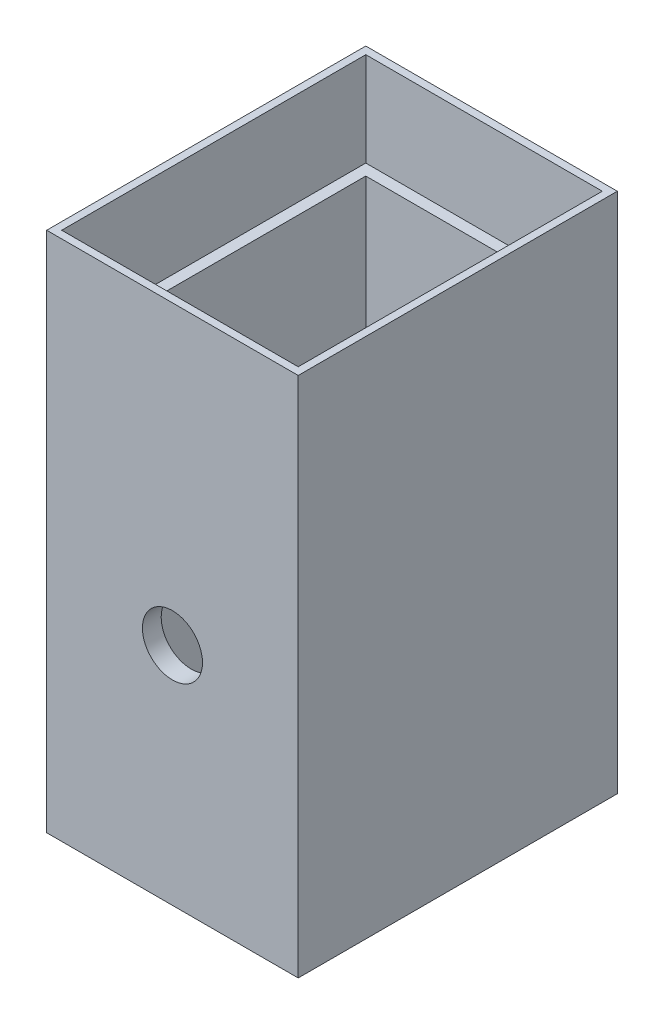
ISO-10303-21;
HEADER;
FILE_DESCRIPTION(('STEP AP214'),'2;1');
FILE_NAME('part.step','',(''),(''),'','','');
FILE_SCHEMA(('AUTOMOTIVE_DESIGN { 1 0 10303 214 1 1 1 1 }'));
ENDSEC;
DATA;
#1=APPLICATION_CONTEXT('core data for automotive mechanical design processes');
#2=APPLICATION_PROTOCOL_DEFINITION('international standard','automotive_design',2000,#1);
#3=PRODUCT_CONTEXT('',#1,'mechanical');
#4=PRODUCT('Part','Part','',(#3));
#5=PRODUCT_RELATED_PRODUCT_CATEGORY('part','',(#4));
#6=PRODUCT_DEFINITION_FORMATION('','',#4);
#7=PRODUCT_DEFINITION_CONTEXT('part definition',#1,'design');
#8=PRODUCT_DEFINITION('design','',#6,#7);
#9=PRODUCT_DEFINITION_SHAPE('','',#8);
#10=(LENGTH_UNIT() NAMED_UNIT(*) SI_UNIT(.MILLI.,.METRE.));
#11=(NAMED_UNIT(*) PLANE_ANGLE_UNIT() SI_UNIT($,.RADIAN.));
#12=(NAMED_UNIT(*) SI_UNIT($,.STERADIAN.) SOLID_ANGLE_UNIT());
#13=UNCERTAINTY_MEASURE_WITH_UNIT(LENGTH_MEASURE(1.E-05),#10,'distance_accuracy_value','');
#14=(GEOMETRIC_REPRESENTATION_CONTEXT(3) GLOBAL_UNCERTAINTY_ASSIGNED_CONTEXT((#13)) GLOBAL_UNIT_ASSIGNED_CONTEXT((#10,
#11,#12)) REPRESENTATION_CONTEXT('',''));
#15=CARTESIAN_POINT('',(0.,0.,0.));
#16=DIRECTION('',(0.,0.,1.));
#17=DIRECTION('',(1.,0.,0.));
#18=AXIS2_PLACEMENT_3D('',#15,#16,#17);
#19=CARTESIAN_POINT('',(0.,114.,0.));
#20=DIRECTION('',(0.,1.,0.));
#21=DIRECTION('',(0.,0.,1.));
#22=AXIS2_PLACEMENT_3D('',#19,#20,#21);
#23=PLANE('',#22);
#24=DIRECTION('',(0.,0.,-1.));
#25=VECTOR('',#24,1.);
#26=CARTESIAN_POINT('',(31.5,114.,40.5));
#27=LINE('',#26,#25);
#28=CARTESIAN_POINT('',(31.5,114.,40.5));
#29=VERTEX_POINT('',#28);
#30=CARTESIAN_POINT('',(31.5,114.,-40.5));
#31=VERTEX_POINT('',#30);
#32=EDGE_CURVE('E189',#29,#31,#27,.T.);
#33=ORIENTED_EDGE('',*,*,#32,.T.);
#34=DIRECTION('',(-1.,0.,0.));
#35=VECTOR('',#34,1.);
#36=CARTESIAN_POINT('',(31.5,114.,-40.5));
#37=LINE('',#36,#35);
#38=CARTESIAN_POINT('',(-31.5,114.,-40.5));
#39=VERTEX_POINT('',#38);
#40=EDGE_CURVE('E202',#31,#39,#37,.T.);
#41=ORIENTED_EDGE('',*,*,#40,.T.);
#42=DIRECTION('',(0.,0.,1.));
#43=VECTOR('',#42,1.);
#44=CARTESIAN_POINT('',(-31.5,114.,40.5));
#45=LINE('',#44,#43);
#46=CARTESIAN_POINT('',(-31.5,114.,40.5));
#47=VERTEX_POINT('',#46);
#48=EDGE_CURVE('E204',#39,#47,#45,.T.);
#49=ORIENTED_EDGE('',*,*,#48,.T.);
#50=DIRECTION('',(1.,0.,0.));
#51=VECTOR('',#50,1.);
#52=CARTESIAN_POINT('',(31.5,114.,40.5));
#53=LINE('',#52,#51);
#54=EDGE_CURVE('E193',#47,#29,#53,.T.);
#55=ORIENTED_EDGE('',*,*,#54,.T.);
#56=EDGE_LOOP('',(#33,#41,#49,#55));
#57=FACE_BOUND('',#56,.T.);
#58=DIRECTION('',(-1.,0.,0.));
#59=VECTOR('',#58,1.);
#60=CARTESIAN_POINT('',(-28.5,114.,-37.5));
#61=LINE('',#60,#59);
#62=CARTESIAN_POINT('',(28.5,114.,-37.5));
#63=VERTEX_POINT('',#62);
#64=CARTESIAN_POINT('',(-28.5,114.,-37.5));
#65=VERTEX_POINT('',#64);
#66=EDGE_CURVE('E232',#63,#65,#61,.T.);
#67=ORIENTED_EDGE('',*,*,#66,.F.);
#68=DIRECTION('',(0.,0.,-1.));
#69=VECTOR('',#68,1.);
#70=CARTESIAN_POINT('',(28.5,114.,-37.5));
#71=LINE('',#70,#69);
#72=CARTESIAN_POINT('',(28.5,114.,37.5));
#73=VERTEX_POINT('',#72);
#74=EDGE_CURVE('E230',#73,#63,#71,.T.);
#75=ORIENTED_EDGE('',*,*,#74,.F.);
#76=DIRECTION('',(1.,0.,0.));
#77=VECTOR('',#76,1.);
#78=CARTESIAN_POINT('',(-28.5,114.,37.5));
#79=LINE('',#78,#77);
#80=CARTESIAN_POINT('',(-28.5,114.,37.5));
#81=VERTEX_POINT('',#80);
#82=EDGE_CURVE('E237',#81,#73,#79,.T.);
#83=ORIENTED_EDGE('',*,*,#82,.F.);
#84=DIRECTION('',(0.,0.,1.));
#85=VECTOR('',#84,1.);
#86=CARTESIAN_POINT('',(-28.5,114.,-37.5));
#87=LINE('',#86,#85);
#88=EDGE_CURVE('E234',#65,#81,#87,.T.);
#89=ORIENTED_EDGE('',*,*,#88,.F.);
#90=EDGE_LOOP('',(#67,#75,#83,#89));
#91=FACE_BOUND('',#90,.T.);
#92=ADVANCED_FACE('F37',(#57,#91),#23,.T.);
#93=CARTESIAN_POINT('',(28.5,114.,-37.5));
#94=DIRECTION('',(-1.,0.,0.));
#95=DIRECTION('',(0.,0.,1.));
#96=AXIS2_PLACEMENT_3D('',#93,#94,#95);
#97=PLANE('',#96);
#98=DIRECTION('',(0.,-1.,0.));
#99=VECTOR('',#98,1.);
#100=CARTESIAN_POINT('',(28.5,114.,-37.5));
#101=LINE('',#100,#99);
#102=CARTESIAN_POINT('',(28.5,4.,-37.5));
#103=VERTEX_POINT('',#102);
#104=EDGE_CURVE('E248',#63,#103,#101,.T.);
#105=ORIENTED_EDGE('',*,*,#104,.T.);
#106=DIRECTION('',(0.,0.,1.));
#107=VECTOR('',#106,1.);
#108=CARTESIAN_POINT('',(28.5,4.,0.));
#109=LINE('',#108,#107);
#110=CARTESIAN_POINT('',(28.5,4.,37.5));
#111=VERTEX_POINT('',#110);
#112=EDGE_CURVE('E260',#103,#111,#109,.T.);
#113=ORIENTED_EDGE('',*,*,#112,.T.);
#114=DIRECTION('',(0.,-1.,0.));
#115=VECTOR('',#114,1.);
#116=CARTESIAN_POINT('',(28.5,114.,37.5));
#117=LINE('',#116,#115);
#118=EDGE_CURVE('E239',#73,#111,#117,.T.);
#119=ORIENTED_EDGE('',*,*,#118,.F.);
#120=ORIENTED_EDGE('',*,*,#74,.T.);
#121=EDGE_LOOP('',(#105,#113,#119,#120));
#122=FACE_BOUND('',#121,.T.);
#123=ADVANCED_FACE('F306',(#122),#97,.T.);
#124=CARTESIAN_POINT('',(-28.5,114.,-37.5));
#125=DIRECTION('',(0.,0.,1.));
#126=DIRECTION('',(1.,0.,0.));
#127=AXIS2_PLACEMENT_3D('',#124,#125,#126);
#128=PLANE('',#127);
#129=DIRECTION('',(0.,-1.,0.));
#130=VECTOR('',#129,1.);
#131=CARTESIAN_POINT('',(-23.5,114.,-37.5));
#132=LINE('',#131,#130);
#133=CARTESIAN_POINT('',(-23.5,22.,-37.5));
#134=VERTEX_POINT('',#133);
#135=CARTESIAN_POINT('',(-23.5,7.,-37.5));
#136=VERTEX_POINT('',#135);
#137=EDGE_CURVE('E181',#134,#136,#132,.T.);
#138=ORIENTED_EDGE('',*,*,#137,.F.);
#139=DIRECTION('',(-1.,0.,0.));
#140=VECTOR('',#139,1.);
#141=CARTESIAN_POINT('',(-28.5,22.,-37.5));
#142=LINE('',#141,#140);
#143=CARTESIAN_POINT('',(-13.5,22.,-37.5));
#144=VERTEX_POINT('',#143);
#145=EDGE_CURVE('E174',#144,#134,#142,.T.);
#146=ORIENTED_EDGE('',*,*,#145,.F.);
#147=DIRECTION('',(0.,1.,0.));
#148=VECTOR('',#147,1.);
#149=CARTESIAN_POINT('',(-13.5,114.,-37.5));
#150=LINE('',#149,#148);
#151=CARTESIAN_POINT('',(-13.5,7.,-37.5));
#152=VERTEX_POINT('',#151);
#153=EDGE_CURVE('E155',#152,#144,#150,.T.);
#154=ORIENTED_EDGE('',*,*,#153,.F.);
#155=DIRECTION('',(1.,0.,0.));
#156=VECTOR('',#155,1.);
#157=CARTESIAN_POINT('',(-28.5,7.00000000000001,-37.5));
#158=LINE('',#157,#156);
#159=EDGE_CURVE('E179',#136,#152,#158,.T.);
#160=ORIENTED_EDGE('',*,*,#159,.F.);
#161=EDGE_LOOP('',(#138,#146,#154,#160));
#162=FACE_BOUND('',#161,.T.);
#163=DIRECTION('',(0.,-1.,0.));
#164=VECTOR('',#163,1.);
#165=CARTESIAN_POINT('',(-28.5,114.,-37.5));
#166=LINE('',#165,#164);
#167=CARTESIAN_POINT('',(-28.5,4.,-37.5));
#168=VERTEX_POINT('',#167);
#169=EDGE_CURVE('E245',#65,#168,#166,.T.);
#170=ORIENTED_EDGE('',*,*,#169,.T.);
#171=DIRECTION('',(1.,0.,0.));
#172=VECTOR('',#171,1.);
#173=CARTESIAN_POINT('',(0.,4.,-37.5));
#174=LINE('',#173,#172);
#175=EDGE_CURVE('E257',#168,#103,#174,.T.);
#176=ORIENTED_EDGE('',*,*,#175,.T.);
#177=ORIENTED_EDGE('',*,*,#104,.F.);
#178=ORIENTED_EDGE('',*,*,#66,.T.);
#179=EDGE_LOOP('',(#170,#176,#177,#178));
#180=FACE_BOUND('',#179,.T.);
#181=ADVANCED_FACE('F312',(#162,#180),#128,.T.);
#182=CARTESIAN_POINT('',(-28.5,114.,-37.5));
#183=DIRECTION('',(1.,0.,0.));
#184=DIRECTION('',(0.,0.,-1.));
#185=AXIS2_PLACEMENT_3D('',#182,#183,#184);
#186=PLANE('',#185);
#187=DIRECTION('',(0.,-1.,0.));
#188=VECTOR('',#187,1.);
#189=CARTESIAN_POINT('',(-28.5,114.,37.5));
#190=LINE('',#189,#188);
#191=CARTESIAN_POINT('',(-28.5,4.00000000000003,37.5));
#192=VERTEX_POINT('',#191);
#193=EDGE_CURVE('E242',#81,#192,#190,.T.);
#194=ORIENTED_EDGE('',*,*,#193,.T.);
#195=DIRECTION('',(0.,0.,-1.));
#196=VECTOR('',#195,1.);
#197=CARTESIAN_POINT('',(-28.5,4.,0.));
#198=LINE('',#197,#196);
#199=EDGE_CURVE('E254',#192,#168,#198,.T.);
#200=ORIENTED_EDGE('',*,*,#199,.T.);
#201=ORIENTED_EDGE('',*,*,#169,.F.);
#202=ORIENTED_EDGE('',*,*,#88,.T.);
#203=EDGE_LOOP('',(#194,#200,#201,#202));
#204=FACE_BOUND('',#203,.T.);
#205=ADVANCED_FACE('F360',(#204),#186,.T.);
#206=CARTESIAN_POINT('',(-28.5,114.,37.5));
#207=DIRECTION('',(0.,0.,-1.));
#208=DIRECTION('',(-1.,0.,0.));
#209=AXIS2_PLACEMENT_3D('',#206,#207,#208);
#210=PLANE('',#209);
#211=CARTESIAN_POINT('',(0.,60.,37.5));
#212=DIRECTION('',(0.,0.,-1.));
#213=DIRECTION('',(-1.,0.,0.));
#214=AXIS2_PLACEMENT_3D('',#211,#212,#213);
#215=CIRCLE('',#214,8.);
#216=CARTESIAN_POINT('',(-8.,60.,37.5));
#217=VERTEX_POINT('',#216);
#218=EDGE_CURVE('E186',#217,#217,#215,.T.);
#219=ORIENTED_EDGE('',*,*,#218,.F.);
#220=EDGE_LOOP('',(#219));
#221=FACE_BOUND('',#220,.T.);
#222=ORIENTED_EDGE('',*,*,#118,.T.);
#223=DIRECTION('',(-1.,0.,0.));
#224=VECTOR('',#223,1.);
#225=CARTESIAN_POINT('',(0.,4.,37.5));
#226=LINE('',#225,#224);
#227=EDGE_CURVE('E251',#111,#192,#226,.T.);
#228=ORIENTED_EDGE('',*,*,#227,.T.);
#229=ORIENTED_EDGE('',*,*,#193,.F.);
#230=ORIENTED_EDGE('',*,*,#82,.T.);
#231=EDGE_LOOP('',(#222,#228,#229,#230));
#232=FACE_BOUND('',#231,.T.);
#233=ADVANCED_FACE('F320',(#221,#232),#210,.T.);
#234=CARTESIAN_POINT('',(0.,4.,0.));
#235=DIRECTION('',(0.,1.,0.));
#236=DIRECTION('',(0.,0.,1.));
#237=AXIS2_PLACEMENT_3D('',#234,#235,#236);
#238=PLANE('',#237);
#239=ORIENTED_EDGE('',*,*,#112,.F.);
#240=ORIENTED_EDGE('',*,*,#175,.F.);
#241=ORIENTED_EDGE('',*,*,#199,.F.);
#242=ORIENTED_EDGE('',*,*,#227,.F.);
#243=EDGE_LOOP('',(#239,#240,#241,#242));
#244=FACE_BOUND('',#243,.T.);
#245=ADVANCED_FACE('F318',(#244),#238,.T.);
#246=CARTESIAN_POINT('',(0.,139.,0.));
#247=DIRECTION('',(0.,1.,0.));
#248=DIRECTION('',(0.,0.,1.));
#249=AXIS2_PLACEMENT_3D('',#246,#247,#248);
#250=PLANE('',#249);
#251=DIRECTION('',(0.,0.,1.));
#252=VECTOR('',#251,1.);
#253=CARTESIAN_POINT('',(-33.5,139.,42.5));
#254=LINE('',#253,#252);
#255=CARTESIAN_POINT('',(-33.5,139.,-42.5));
#256=VERTEX_POINT('',#255);
#257=CARTESIAN_POINT('',(-33.5,139.,42.5));
#258=VERTEX_POINT('',#257);
#259=EDGE_CURVE('E218',#256,#258,#254,.T.);
#260=ORIENTED_EDGE('',*,*,#259,.T.);
#261=DIRECTION('',(1.,0.,0.));
#262=VECTOR('',#261,1.);
#263=CARTESIAN_POINT('',(33.5,139.,42.5));
#264=LINE('',#263,#262);
#265=CARTESIAN_POINT('',(33.5,139.,42.5));
#266=VERTEX_POINT('',#265);
#267=EDGE_CURVE('E221',#258,#266,#264,.T.);
#268=ORIENTED_EDGE('',*,*,#267,.T.);
#269=DIRECTION('',(0.,0.,-1.));
#270=VECTOR('',#269,1.);
#271=CARTESIAN_POINT('',(33.5,139.,42.5));
#272=LINE('',#271,#270);
#273=CARTESIAN_POINT('',(33.5,139.,-42.5));
#274=VERTEX_POINT('',#273);
#275=EDGE_CURVE('E224',#266,#274,#272,.T.);
#276=ORIENTED_EDGE('',*,*,#275,.T.);
#277=DIRECTION('',(-1.,0.,0.));
#278=VECTOR('',#277,1.);
#279=CARTESIAN_POINT('',(33.5,139.,-42.5));
#280=LINE('',#279,#278);
#281=EDGE_CURVE('E227',#274,#256,#280,.T.);
#282=ORIENTED_EDGE('',*,*,#281,.T.);
#283=EDGE_LOOP('',(#260,#268,#276,#282));
#284=FACE_BOUND('',#283,.T.);
#285=DIRECTION('',(-1.,0.,0.));
#286=VECTOR('',#285,1.);
#287=CARTESIAN_POINT('',(31.5,139.,-40.5));
#288=LINE('',#287,#286);
#289=CARTESIAN_POINT('',(31.5,139.,-40.5));
#290=VERTEX_POINT('',#289);
#291=CARTESIAN_POINT('',(-31.5,139.,-40.5));
#292=VERTEX_POINT('',#291);
#293=EDGE_CURVE('E192',#290,#292,#288,.T.);
#294=ORIENTED_EDGE('',*,*,#293,.F.);
#295=DIRECTION('',(0.,0.,-1.));
#296=VECTOR('',#295,1.);
#297=CARTESIAN_POINT('',(31.5,139.,40.5));
#298=LINE('',#297,#296);
#299=CARTESIAN_POINT('',(31.5,139.,40.5));
#300=VERTEX_POINT('',#299);
#301=EDGE_CURVE('E190',#300,#290,#298,.T.);
#302=ORIENTED_EDGE('',*,*,#301,.F.);
#303=DIRECTION('',(1.,0.,0.));
#304=VECTOR('',#303,1.);
#305=CARTESIAN_POINT('',(31.5,139.,40.5));
#306=LINE('',#305,#304);
#307=CARTESIAN_POINT('',(-31.5,139.,40.5));
#308=VERTEX_POINT('',#307);
#309=EDGE_CURVE('E198',#308,#300,#306,.T.);
#310=ORIENTED_EDGE('',*,*,#309,.F.);
#311=DIRECTION('',(0.,0.,1.));
#312=VECTOR('',#311,1.);
#313=CARTESIAN_POINT('',(-31.5,139.,40.5));
#314=LINE('',#313,#312);
#315=EDGE_CURVE('E195',#292,#308,#314,.T.);
#316=ORIENTED_EDGE('',*,*,#315,.F.);
#317=EDGE_LOOP('',(#294,#302,#310,#316));
#318=FACE_BOUND('',#317,.T.);
#319=ADVANCED_FACE('F293',(#284,#318),#250,.T.);
#320=CARTESIAN_POINT('',(31.5,139.,40.5));
#321=DIRECTION('',(-1.,0.,0.));
#322=DIRECTION('',(0.,0.,1.));
#323=AXIS2_PLACEMENT_3D('',#320,#321,#322);
#324=PLANE('',#323);
#325=ORIENTED_EDGE('',*,*,#32,.F.);
#326=DIRECTION('',(0.,-1.,0.));
#327=VECTOR('',#326,1.);
#328=CARTESIAN_POINT('',(31.5,139.,40.5));
#329=LINE('',#328,#327);
#330=EDGE_CURVE('E200',#300,#29,#329,.T.);
#331=ORIENTED_EDGE('',*,*,#330,.F.);
#332=ORIENTED_EDGE('',*,*,#301,.T.);
#333=DIRECTION('',(0.,-1.,0.));
#334=VECTOR('',#333,1.);
#335=CARTESIAN_POINT('',(31.5,139.,-40.5));
#336=LINE('',#335,#334);
#337=EDGE_CURVE('E215',#290,#31,#336,.T.);
#338=ORIENTED_EDGE('',*,*,#337,.T.);
#339=EDGE_LOOP('',(#325,#331,#332,#338));
#340=FACE_BOUND('',#339,.T.);
#341=ADVANCED_FACE('F351',(#340),#324,.T.);
#342=CARTESIAN_POINT('',(31.5,139.,-40.5));
#343=DIRECTION('',(0.,0.,1.));
#344=DIRECTION('',(1.,0.,0.));
#345=AXIS2_PLACEMENT_3D('',#342,#343,#344);
#346=PLANE('',#345);
#347=ORIENTED_EDGE('',*,*,#40,.F.);
#348=ORIENTED_EDGE('',*,*,#337,.F.);
#349=ORIENTED_EDGE('',*,*,#293,.T.);
#350=DIRECTION('',(0.,-1.,0.));
#351=VECTOR('',#350,1.);
#352=CARTESIAN_POINT('',(-31.5,139.,-40.5));
#353=LINE('',#352,#351);
#354=EDGE_CURVE('E212',#292,#39,#353,.T.);
#355=ORIENTED_EDGE('',*,*,#354,.T.);
#356=EDGE_LOOP('',(#347,#348,#349,#355));
#357=FACE_BOUND('',#356,.T.);
#358=ADVANCED_FACE('F347',(#357),#346,.T.);
#359=CARTESIAN_POINT('',(-31.5,139.,40.5));
#360=DIRECTION('',(1.,0.,0.));
#361=DIRECTION('',(0.,0.,-1.));
#362=AXIS2_PLACEMENT_3D('',#359,#360,#361);
#363=PLANE('',#362);
#364=ORIENTED_EDGE('',*,*,#48,.F.);
#365=ORIENTED_EDGE('',*,*,#354,.F.);
#366=ORIENTED_EDGE('',*,*,#315,.T.);
#367=DIRECTION('',(0.,-1.,0.));
#368=VECTOR('',#367,1.);
#369=CARTESIAN_POINT('',(-31.5,139.,40.5));
#370=LINE('',#369,#368);
#371=EDGE_CURVE('E209',#308,#47,#370,.T.);
#372=ORIENTED_EDGE('',*,*,#371,.T.);
#373=EDGE_LOOP('',(#364,#365,#366,#372));
#374=FACE_BOUND('',#373,.T.);
#375=ADVANCED_FACE('F343',(#374),#363,.T.);
#376=CARTESIAN_POINT('',(31.5,139.,40.5));
#377=DIRECTION('',(0.,0.,-1.));
#378=DIRECTION('',(-1.,0.,0.));
#379=AXIS2_PLACEMENT_3D('',#376,#377,#378);
#380=PLANE('',#379);
#381=ORIENTED_EDGE('',*,*,#54,.F.);
#382=ORIENTED_EDGE('',*,*,#371,.F.);
#383=ORIENTED_EDGE('',*,*,#309,.T.);
#384=ORIENTED_EDGE('',*,*,#330,.T.);
#385=EDGE_LOOP('',(#381,#382,#383,#384));
#386=FACE_BOUND('',#385,.T.);
#387=ADVANCED_FACE('F303',(#386),#380,.T.);
#388=CARTESIAN_POINT('',(0.,0.,0.));
#389=DIRECTION('',(0.,1.,0.));
#390=DIRECTION('',(0.,0.,1.));
#391=AXIS2_PLACEMENT_3D('',#388,#389,#390);
#392=PLANE('',#391);
#393=DIRECTION('',(1.,0.,0.));
#394=VECTOR('',#393,1.);
#395=CARTESIAN_POINT('',(0.,0.,-42.5));
#396=LINE('',#395,#394);
#397=CARTESIAN_POINT('',(-33.5,0.,-42.5));
#398=VERTEX_POINT('',#397);
#399=CARTESIAN_POINT('',(33.5,0.,-42.5));
#400=VERTEX_POINT('',#399);
#401=EDGE_CURVE('E263',#398,#400,#396,.T.);
#402=ORIENTED_EDGE('',*,*,#401,.T.);
#403=DIRECTION('',(0.,0.,1.));
#404=VECTOR('',#403,1.);
#405=CARTESIAN_POINT('',(33.5,0.,0.));
#406=LINE('',#405,#404);
#407=CARTESIAN_POINT('',(33.5,0.,42.5));
#408=VERTEX_POINT('',#407);
#409=EDGE_CURVE('E271',#400,#408,#406,.T.);
#410=ORIENTED_EDGE('',*,*,#409,.T.);
#411=DIRECTION('',(1.,0.,0.));
#412=VECTOR('',#411,1.);
#413=CARTESIAN_POINT('',(0.,0.,42.5));
#414=LINE('',#413,#412);
#415=CARTESIAN_POINT('',(-33.5,0.,42.5));
#416=VERTEX_POINT('',#415);
#417=EDGE_CURVE('E268',#416,#408,#414,.T.);
#418=ORIENTED_EDGE('',*,*,#417,.F.);
#419=DIRECTION('',(0.,0.,1.));
#420=VECTOR('',#419,1.);
#421=CARTESIAN_POINT('',(-33.5,0.,0.));
#422=LINE('',#421,#420);
#423=EDGE_CURVE('E266',#398,#416,#422,.T.);
#424=ORIENTED_EDGE('',*,*,#423,.F.);
#425=EDGE_LOOP('',(#402,#410,#418,#424));
#426=FACE_BOUND('',#425,.T.);
#427=ADVANCED_FACE('F286',(#426),#392,.F.);
#428=CARTESIAN_POINT('',(0.,4.,-42.5));
#429=DIRECTION('',(0.,0.,-1.));
#430=DIRECTION('',(-1.,0.,0.));
#431=AXIS2_PLACEMENT_3D('',#428,#429,#430);
#432=PLANE('',#431);
#433=DIRECTION('',(0.,1.,0.));
#434=VECTOR('',#433,1.);
#435=CARTESIAN_POINT('',(-23.5,22.,-42.5));
#436=LINE('',#435,#434);
#437=CARTESIAN_POINT('',(-23.5,7.,-42.5));
#438=VERTEX_POINT('',#437);
#439=CARTESIAN_POINT('',(-23.5,22.,-42.5));
#440=VERTEX_POINT('',#439);
#441=EDGE_CURVE('E60',#438,#440,#436,.T.);
#442=ORIENTED_EDGE('',*,*,#441,.F.);
#443=DIRECTION('',(-1.,0.,0.));
#444=VECTOR('',#443,1.);
#445=CARTESIAN_POINT('',(-13.5,7.,-42.5));
#446=LINE('',#445,#444);
#447=CARTESIAN_POINT('',(-13.5,7.,-42.5));
#448=VERTEX_POINT('',#447);
#449=EDGE_CURVE('E167',#448,#438,#446,.T.);
#450=ORIENTED_EDGE('',*,*,#449,.F.);
#451=DIRECTION('',(0.,-1.,0.));
#452=VECTOR('',#451,1.);
#453=CARTESIAN_POINT('',(-13.5,22.,-42.5));
#454=LINE('',#453,#452);
#455=CARTESIAN_POINT('',(-13.5,22.,-42.5));
#456=VERTEX_POINT('',#455);
#457=EDGE_CURVE('E152',#456,#448,#454,.T.);
#458=ORIENTED_EDGE('',*,*,#457,.F.);
#459=DIRECTION('',(1.,0.,0.));
#460=VECTOR('',#459,1.);
#461=CARTESIAN_POINT('',(-13.5,22.,-42.5));
#462=LINE('',#461,#460);
#463=EDGE_CURVE('E161',#440,#456,#462,.T.);
#464=ORIENTED_EDGE('',*,*,#463,.F.);
#465=EDGE_LOOP('',(#442,#450,#458,#464));
#466=FACE_BOUND('',#465,.T.);
#467=ORIENTED_EDGE('',*,*,#401,.F.);
#468=DIRECTION('',(0.,-1.,0.));
#469=VECTOR('',#468,1.);
#470=CARTESIAN_POINT('',(-33.5,4.,-42.5));
#471=LINE('',#470,#469);
#472=EDGE_CURVE('E11',#256,#398,#471,.T.);
#473=ORIENTED_EDGE('',*,*,#472,.F.);
#474=ORIENTED_EDGE('',*,*,#281,.F.);
#475=DIRECTION('',(0.,-1.,0.));
#476=VECTOR('',#475,1.);
#477=CARTESIAN_POINT('',(33.5,4.,-42.5));
#478=LINE('',#477,#476);
#479=EDGE_CURVE('E274',#274,#400,#478,.T.);
#480=ORIENTED_EDGE('',*,*,#479,.T.);
#481=EDGE_LOOP('',(#467,#473,#474,#480));
#482=FACE_BOUND('',#481,.T.);
#483=ADVANCED_FACE('F39',(#466,#482),#432,.T.);
#484=CARTESIAN_POINT('',(33.5,4.,0.));
#485=DIRECTION('',(1.,0.,0.));
#486=DIRECTION('',(0.,0.,-1.));
#487=AXIS2_PLACEMENT_3D('',#484,#485,#486);
#488=PLANE('',#487);
#489=ORIENTED_EDGE('',*,*,#409,.F.);
#490=ORIENTED_EDGE('',*,*,#479,.F.);
#491=ORIENTED_EDGE('',*,*,#275,.F.);
#492=DIRECTION('',(0.,-1.,0.));
#493=VECTOR('',#492,1.);
#494=CARTESIAN_POINT('',(33.5,4.,42.5));
#495=LINE('',#494,#493);
#496=EDGE_CURVE('E276',#266,#408,#495,.T.);
#497=ORIENTED_EDGE('',*,*,#496,.T.);
#498=EDGE_LOOP('',(#489,#490,#491,#497));
#499=FACE_BOUND('',#498,.T.);
#500=ADVANCED_FACE('F290',(#499),#488,.T.);
#501=CARTESIAN_POINT('',(0.,4.,42.5));
#502=DIRECTION('',(0.,0.,-1.));
#503=DIRECTION('',(-1.,0.,0.));
#504=AXIS2_PLACEMENT_3D('',#501,#502,#503);
#505=PLANE('',#504);
#506=CARTESIAN_POINT('',(0.,60.,42.5));
#507=DIRECTION('',(0.,0.,1.));
#508=DIRECTION('',(1.,0.,0.));
#509=AXIS2_PLACEMENT_3D('',#506,#507,#508);
#510=CIRCLE('',#509,8.);
#511=CARTESIAN_POINT('',(8.,60.,42.5));
#512=VERTEX_POINT('',#511);
#513=EDGE_CURVE('E183',#512,#512,#510,.T.);
#514=ORIENTED_EDGE('',*,*,#513,.F.);
#515=EDGE_LOOP('',(#514));
#516=FACE_BOUND('',#515,.T.);
#517=ORIENTED_EDGE('',*,*,#417,.T.);
#518=ORIENTED_EDGE('',*,*,#496,.F.);
#519=ORIENTED_EDGE('',*,*,#267,.F.);
#520=DIRECTION('',(0.,-1.,0.));
#521=VECTOR('',#520,1.);
#522=CARTESIAN_POINT('',(-33.5,4.,42.5));
#523=LINE('',#522,#521);
#524=EDGE_CURVE('E45',#258,#416,#523,.T.);
#525=ORIENTED_EDGE('',*,*,#524,.T.);
#526=EDGE_LOOP('',(#517,#518,#519,#525));
#527=FACE_BOUND('',#526,.T.);
#528=ADVANCED_FACE('F281',(#516,#527),#505,.F.);
#529=CARTESIAN_POINT('',(-33.5,4.,0.));
#530=DIRECTION('',(1.,0.,0.));
#531=DIRECTION('',(0.,0.,-1.));
#532=AXIS2_PLACEMENT_3D('',#529,#530,#531);
#533=PLANE('',#532);
#534=ORIENTED_EDGE('',*,*,#423,.T.);
#535=ORIENTED_EDGE('',*,*,#524,.F.);
#536=ORIENTED_EDGE('',*,*,#259,.F.);
#537=ORIENTED_EDGE('',*,*,#472,.T.);
#538=EDGE_LOOP('',(#534,#535,#536,#537));
#539=FACE_BOUND('',#538,.T.);
#540=ADVANCED_FACE('F296',(#539),#533,.F.);
#541=CARTESIAN_POINT('',(0.,60.,17.5));
#542=DIRECTION('',(0.,0.,1.));
#543=DIRECTION('',(1.,0.,0.));
#544=AXIS2_PLACEMENT_3D('',#541,#542,#543);
#545=CYLINDRICAL_SURFACE('',#544,8.);
#546=ORIENTED_EDGE('',*,*,#218,.T.);
#547=EDGE_LOOP('',(#546));
#548=FACE_BOUND('',#547,.T.);
#549=ORIENTED_EDGE('',*,*,#513,.T.);
#550=EDGE_LOOP('',(#549));
#551=FACE_BOUND('',#550,.T.);
#552=ADVANCED_FACE('F326',(#548,#551),#545,.F.);
#553=CARTESIAN_POINT('',(-23.5,22.,-17.5));
#554=DIRECTION('',(-1.,0.,0.));
#555=DIRECTION('',(0.,0.,1.));
#556=AXIS2_PLACEMENT_3D('',#553,#554,#555);
#557=PLANE('',#556);
#558=ORIENTED_EDGE('',*,*,#137,.T.);
#559=DIRECTION('',(0.,0.,-1.));
#560=VECTOR('',#559,1.);
#561=CARTESIAN_POINT('',(-23.5,7.,-17.5));
#562=LINE('',#561,#560);
#563=EDGE_CURVE('E172',#136,#438,#562,.T.);
#564=ORIENTED_EDGE('',*,*,#563,.T.);
#565=ORIENTED_EDGE('',*,*,#441,.T.);
#566=DIRECTION('',(0.,0.,-1.));
#567=VECTOR('',#566,1.);
#568=CARTESIAN_POINT('',(-23.5,22.,-17.5));
#569=LINE('',#568,#567);
#570=EDGE_CURVE('E158',#134,#440,#569,.T.);
#571=ORIENTED_EDGE('',*,*,#570,.F.);
#572=EDGE_LOOP('',(#558,#564,#565,#571));
#573=FACE_BOUND('',#572,.T.);
#574=ADVANCED_FACE('F330',(#573),#557,.F.);
#575=CARTESIAN_POINT('',(-13.5,7.,-17.5));
#576=DIRECTION('',(0.,-1.,0.));
#577=DIRECTION('',(1.,0.,0.));
#578=AXIS2_PLACEMENT_3D('',#575,#576,#577);
#579=PLANE('',#578);
#580=ORIENTED_EDGE('',*,*,#159,.T.);
#581=DIRECTION('',(0.,0.,-1.));
#582=VECTOR('',#581,1.);
#583=CARTESIAN_POINT('',(-13.5,7.,-17.5));
#584=LINE('',#583,#582);
#585=EDGE_CURVE('E157',#152,#448,#584,.T.);
#586=ORIENTED_EDGE('',*,*,#585,.T.);
#587=ORIENTED_EDGE('',*,*,#449,.T.);
#588=ORIENTED_EDGE('',*,*,#563,.F.);
#589=EDGE_LOOP('',(#580,#586,#587,#588));
#590=FACE_BOUND('',#589,.T.);
#591=ADVANCED_FACE('F336',(#590),#579,.F.);
#592=CARTESIAN_POINT('',(-13.5,22.,-17.5));
#593=DIRECTION('',(1.,0.,0.));
#594=DIRECTION('',(0.,1.,0.));
#595=AXIS2_PLACEMENT_3D('',#592,#593,#594);
#596=PLANE('',#595);
#597=ORIENTED_EDGE('',*,*,#153,.T.);
#598=DIRECTION('',(0.,0.,-1.));
#599=VECTOR('',#598,1.);
#600=CARTESIAN_POINT('',(-13.5,22.,-17.5));
#601=LINE('',#600,#599);
#602=EDGE_CURVE('E52',#144,#456,#601,.T.);
#603=ORIENTED_EDGE('',*,*,#602,.T.);
#604=ORIENTED_EDGE('',*,*,#457,.T.);
#605=ORIENTED_EDGE('',*,*,#585,.F.);
#606=EDGE_LOOP('',(#597,#603,#604,#605));
#607=FACE_BOUND('',#606,.T.);
#608=ADVANCED_FACE('F149',(#607),#596,.F.);
#609=CARTESIAN_POINT('',(-13.5,22.,-17.5));
#610=DIRECTION('',(0.,1.,0.));
#611=DIRECTION('',(0.,0.,1.));
#612=AXIS2_PLACEMENT_3D('',#609,#610,#611);
#613=PLANE('',#612);
#614=ORIENTED_EDGE('',*,*,#145,.T.);
#615=ORIENTED_EDGE('',*,*,#570,.T.);
#616=ORIENTED_EDGE('',*,*,#463,.T.);
#617=ORIENTED_EDGE('',*,*,#602,.F.);
#618=EDGE_LOOP('',(#614,#615,#616,#617));
#619=FACE_BOUND('',#618,.T.);
#620=ADVANCED_FACE('F162',(#619),#613,.F.);
#621=CLOSED_SHELL('',(#92,#123,#181,#205,#233,#245,#319,#341,#358,#375,#387,#427,#483,#500,#528,
#540,#552,#574,#591,#608,#620));
#622=MANIFOLD_SOLID_BREP('B2',#621);
#623=ADVANCED_BREP_SHAPE_REPRESENTATION('',(#18,#622),#14);
#624=SHAPE_DEFINITION_REPRESENTATION(#9,#623);
ENDSEC;
END-ISO-10303-21;
